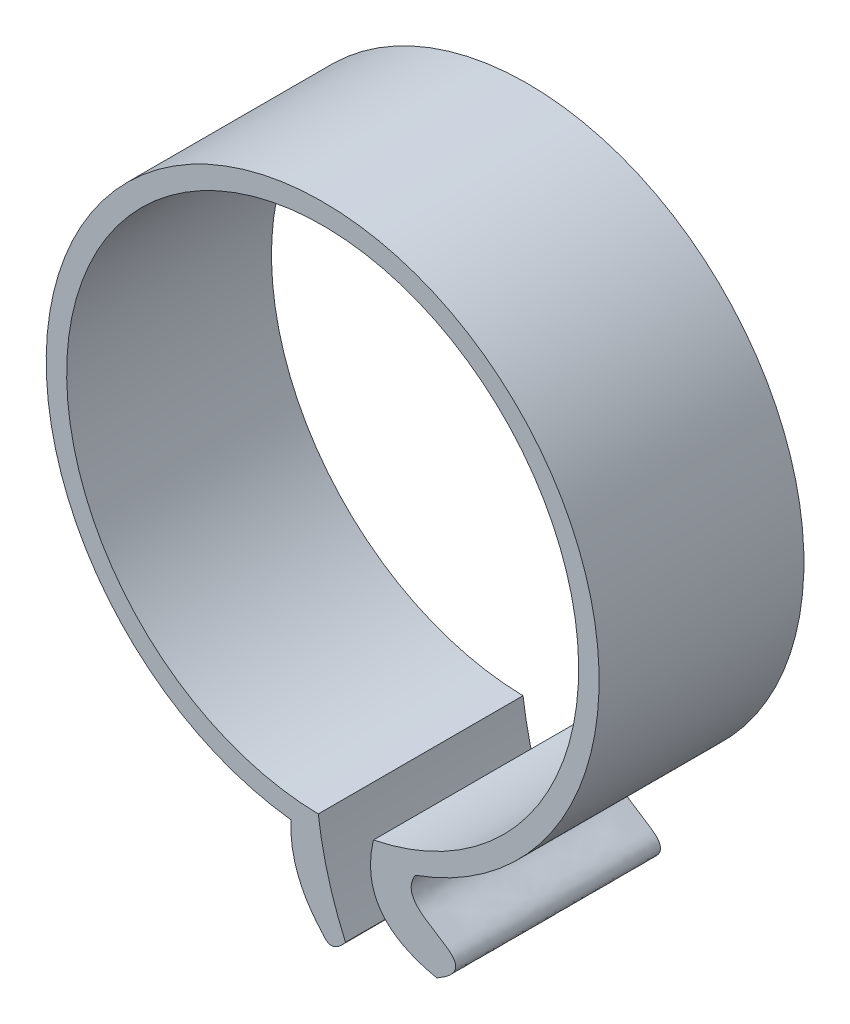
ISO-10303-21;
HEADER;
FILE_DESCRIPTION(('STEP AP214'),'2;1');
FILE_NAME('part.step','',(''),(''),'','','');
FILE_SCHEMA(('AUTOMOTIVE_DESIGN { 1 0 10303 214 1 1 1 1 }'));
ENDSEC;
DATA;
#1=APPLICATION_CONTEXT('core data for automotive mechanical design processes');
#2=APPLICATION_PROTOCOL_DEFINITION('international standard','automotive_design',2000,#1);
#3=PRODUCT_CONTEXT('',#1,'mechanical');
#4=PRODUCT('Part','Part','',(#3));
#5=PRODUCT_RELATED_PRODUCT_CATEGORY('part','',(#4));
#6=PRODUCT_DEFINITION_FORMATION('','',#4);
#7=PRODUCT_DEFINITION_CONTEXT('part definition',#1,'design');
#8=PRODUCT_DEFINITION('design','',#6,#7);
#9=PRODUCT_DEFINITION_SHAPE('','',#8);
#10=(LENGTH_UNIT() NAMED_UNIT(*) SI_UNIT(.MILLI.,.METRE.));
#11=(NAMED_UNIT(*) PLANE_ANGLE_UNIT() SI_UNIT($,.RADIAN.));
#12=(NAMED_UNIT(*) SI_UNIT($,.STERADIAN.) SOLID_ANGLE_UNIT());
#13=UNCERTAINTY_MEASURE_WITH_UNIT(LENGTH_MEASURE(1.E-05),#10,'distance_accuracy_value','');
#14=(GEOMETRIC_REPRESENTATION_CONTEXT(3) GLOBAL_UNCERTAINTY_ASSIGNED_CONTEXT((#13)) GLOBAL_UNIT_ASSIGNED_CONTEXT((#10,
#11,#12)) REPRESENTATION_CONTEXT('',''));
#15=CARTESIAN_POINT('',(0.,0.,0.));
#16=DIRECTION('',(0.,0.,1.));
#17=DIRECTION('',(1.,0.,0.));
#18=AXIS2_PLACEMENT_3D('',#15,#16,#17);
#19=CARTESIAN_POINT('',(1.11542154755995,-17.2603893432157,10.));
#20=CARTESIAN_POINT('',(0.103518304357264,-14.9950560829422,10.));
#21=CARTESIAN_POINT('',(-0.217037466659111,-12.4981156474913,10.));
#22=B_SPLINE_CURVE_WITH_KNOTS('',2,(#19,#20,#21),.UNSPECIFIED.,.F.,.F.,(3,3),(0.,1.),.UNSPECIFIED.);
#23=DIRECTION('',(0.,0.,-1.));
#24=VECTOR('',#23,1.);
#25=SURFACE_OF_LINEAR_EXTRUSION('',#22,#24);
#26=CARTESIAN_POINT('',(1.11542154755995,-17.2603893432157,0.));
#27=CARTESIAN_POINT('',(0.103518304357264,-14.9950560829422,0.));
#28=CARTESIAN_POINT('',(-0.217037466659111,-12.4981156474913,0.));
#29=B_SPLINE_CURVE_WITH_KNOTS('',2,(#26,#27,#28),.UNSPECIFIED.,.F.,.F.,(3,3),(0.,1.),.UNSPECIFIED.);
#30=CARTESIAN_POINT('',(1.11542154755995,-17.2603893432157,0.));
#31=VERTEX_POINT('',#30);
#32=CARTESIAN_POINT('',(-0.217037466659114,-12.4981156474913,0.));
#33=VERTEX_POINT('',#32);
#34=EDGE_CURVE('E225',#31,#33,#29,.T.);
#35=ORIENTED_EDGE('',*,*,#34,.T.);
#36=DIRECTION('',(0.,0.,-1.));
#37=VECTOR('',#36,1.);
#38=CARTESIAN_POINT('',(-0.217037466659114,-12.4981156474913,10.));
#39=LINE('',#38,#37);
#40=CARTESIAN_POINT('',(-0.217037466659114,-12.4981156474913,10.));
#41=VERTEX_POINT('',#40);
#42=EDGE_CURVE('E11',#41,#33,#39,.T.);
#43=ORIENTED_EDGE('',*,*,#42,.F.);
#44=CARTESIAN_POINT('',(1.11542154755995,-17.2603893432157,10.));
#45=VERTEX_POINT('',#44);
#46=EDGE_CURVE('E175',#45,#41,#22,.T.);
#47=ORIENTED_EDGE('',*,*,#46,.F.);
#48=DIRECTION('',(0.,0.,-1.));
#49=VECTOR('',#48,1.);
#50=CARTESIAN_POINT('',(1.11542154755995,-17.2603893432157,10.));
#51=LINE('',#50,#49);
#52=EDGE_CURVE('E131',#45,#31,#51,.T.);
#53=ORIENTED_EDGE('',*,*,#52,.T.);
#54=EDGE_LOOP('',(#35,#43,#47,#53));
#55=FACE_BOUND('',#54,.T.);
#56=ADVANCED_FACE('F39',(#55),#25,.F.);
#57=CARTESIAN_POINT('',(0.,0.,10.));
#58=DIRECTION('',(0.,0.,-1.));
#59=DIRECTION('',(-1.,0.,0.));
#60=AXIS2_PLACEMENT_3D('',#57,#58,#59);
#61=CYLINDRICAL_SURFACE('',#60,12.5);
#62=CARTESIAN_POINT('',(0.,0.,0.));
#63=DIRECTION('',(0.,0.,-1.));
#64=DIRECTION('',(1.,0.,0.));
#65=AXIS2_PLACEMENT_3D('',#62,#63,#64);
#66=CIRCLE('',#65,12.5);
#67=CARTESIAN_POINT('',(2.47842575026643,-12.2518327527116,0.));
#68=VERTEX_POINT('',#67);
#69=EDGE_CURVE('E218',#33,#68,#66,.T.);
#70=ORIENTED_EDGE('',*,*,#69,.T.);
#71=DIRECTION('',(0.,0.,-1.));
#72=VECTOR('',#71,1.);
#73=CARTESIAN_POINT('',(2.47842575026643,-12.2518327527116,10.));
#74=LINE('',#73,#72);
#75=CARTESIAN_POINT('',(2.47842575026643,-12.2518327527116,10.));
#76=VERTEX_POINT('',#75);
#77=EDGE_CURVE('E49',#76,#68,#74,.T.);
#78=ORIENTED_EDGE('',*,*,#77,.F.);
#79=CARTESIAN_POINT('',(0.,0.,10.));
#80=DIRECTION('',(0.,0.,-1.));
#81=DIRECTION('',(1.,0.,0.));
#82=AXIS2_PLACEMENT_3D('',#79,#80,#81);
#83=CIRCLE('',#82,12.5);
#84=EDGE_CURVE('E97',#41,#76,#83,.T.);
#85=ORIENTED_EDGE('',*,*,#84,.F.);
#86=ORIENTED_EDGE('',*,*,#42,.T.);
#87=EDGE_LOOP('',(#70,#78,#85,#86));
#88=FACE_BOUND('',#87,.T.);
#89=ADVANCED_FACE('F252',(#88),#61,.F.);
#90=CARTESIAN_POINT('',(2.47842575026643,-12.2518327527116,10.));
#91=CARTESIAN_POINT('',(1.65495790138646,-15.7273409020841,10.));
#92=CARTESIAN_POINT('',(5.57719429225045,-16.5385568434413,10.));
#93=B_SPLINE_CURVE_WITH_KNOTS('',2,(#90,#91,#92),.UNSPECIFIED.,.F.,.F.,(3,3),(0.,1.),.UNSPECIFIED.);
#94=DIRECTION('',(0.,0.,-1.));
#95=VECTOR('',#94,1.);
#96=SURFACE_OF_LINEAR_EXTRUSION('',#93,#95);
#97=CARTESIAN_POINT('',(2.47842575026643,-12.2518327527116,0.));
#98=CARTESIAN_POINT('',(1.65495790138646,-15.7273409020841,0.));
#99=CARTESIAN_POINT('',(5.57719429225045,-16.5385568434413,0.));
#100=B_SPLINE_CURVE_WITH_KNOTS('',2,(#97,#98,#99),.UNSPECIFIED.,.F.,.F.,(3,3),(0.,1.),.UNSPECIFIED.);
#101=CARTESIAN_POINT('',(5.57719429225045,-16.5385568434413,0.));
#102=VERTEX_POINT('',#101);
#103=EDGE_CURVE('E213',#68,#102,#100,.T.);
#104=ORIENTED_EDGE('',*,*,#103,.T.);
#105=DIRECTION('',(0.,0.,-1.));
#106=VECTOR('',#105,1.);
#107=CARTESIAN_POINT('',(5.57719429225045,-16.5385568434413,10.));
#108=LINE('',#107,#106);
#109=CARTESIAN_POINT('',(5.57719429225045,-16.5385568434413,10.));
#110=VERTEX_POINT('',#109);
#111=EDGE_CURVE('E204',#110,#102,#108,.T.);
#112=ORIENTED_EDGE('',*,*,#111,.F.);
#113=EDGE_CURVE('E162',#76,#110,#93,.T.);
#114=ORIENTED_EDGE('',*,*,#113,.F.);
#115=ORIENTED_EDGE('',*,*,#77,.T.);
#116=EDGE_LOOP('',(#104,#112,#114,#115));
#117=FACE_BOUND('',#116,.T.);
#118=ADVANCED_FACE('F155',(#117),#96,.F.);
#119=CARTESIAN_POINT('',(5.57719429225045,-16.5385568434413,10.));
#120=CARTESIAN_POINT('',(8.54920632253616,-14.8421020857261,10.));
#121=CARTESIAN_POINT('',(3.25322922840647,-14.7466427679077,10.));
#122=CARTESIAN_POINT('',(4.52401427506193,-12.7194062298142,10.));
#123=B_SPLINE_CURVE_WITH_KNOTS('',3,(#119,#120,#121,#122),.UNSPECIFIED.,.F.,.F.,(4,4),(0.,1.),.UNSPECIFIED.);
#124=DIRECTION('',(0.,0.,-1.));
#125=VECTOR('',#124,1.);
#126=SURFACE_OF_LINEAR_EXTRUSION('',#123,#125);
#127=CARTESIAN_POINT('',(5.57719429225045,-16.5385568434413,0.));
#128=CARTESIAN_POINT('',(8.54920632253616,-14.8421020857261,0.));
#129=CARTESIAN_POINT('',(3.25322922840647,-14.7466427679077,0.));
#130=CARTESIAN_POINT('',(4.52401427506193,-12.7194062298142,0.));
#131=B_SPLINE_CURVE_WITH_KNOTS('',3,(#127,#128,#129,#130),.UNSPECIFIED.,.F.,.F.,(4,4),(0.,1.),.UNSPECIFIED.);
#132=CARTESIAN_POINT('',(4.52401427506193,-12.7194062298142,0.));
#133=VERTEX_POINT('',#132);
#134=EDGE_CURVE('E219',#102,#133,#131,.T.);
#135=ORIENTED_EDGE('',*,*,#134,.T.);
#136=DIRECTION('',(0.,0.,-1.));
#137=VECTOR('',#136,1.);
#138=CARTESIAN_POINT('',(4.52401427506193,-12.7194062298142,10.));
#139=LINE('',#138,#137);
#140=CARTESIAN_POINT('',(4.52401427506193,-12.7194062298142,10.));
#141=VERTEX_POINT('',#140);
#142=EDGE_CURVE('E124',#141,#133,#139,.T.);
#143=ORIENTED_EDGE('',*,*,#142,.F.);
#144=EDGE_CURVE('E113',#110,#141,#123,.T.);
#145=ORIENTED_EDGE('',*,*,#144,.F.);
#146=ORIENTED_EDGE('',*,*,#111,.T.);
#147=EDGE_LOOP('',(#135,#143,#145,#146));
#148=FACE_BOUND('',#147,.T.);
#149=ADVANCED_FACE('F152',(#148),#126,.F.);
#150=CARTESIAN_POINT('',(0.,0.,10.));
#151=DIRECTION('',(0.,0.,-1.));
#152=DIRECTION('',(-1.,0.,0.));
#153=AXIS2_PLACEMENT_3D('',#150,#151,#152);
#154=CYLINDRICAL_SURFACE('',#153,13.5);
#155=CARTESIAN_POINT('',(0.,0.,0.));
#156=DIRECTION('',(0.,0.,1.));
#157=DIRECTION('',(1.,0.,0.));
#158=AXIS2_PLACEMENT_3D('',#155,#156,#157);
#159=CIRCLE('',#158,13.5);
#160=CARTESIAN_POINT('',(-1.55602176295616,-13.4100259609445,0.));
#161=VERTEX_POINT('',#160);
#162=EDGE_CURVE('E122',#133,#161,#159,.T.);
#163=ORIENTED_EDGE('',*,*,#162,.T.);
#164=DIRECTION('',(0.,0.,-1.));
#165=VECTOR('',#164,1.);
#166=CARTESIAN_POINT('',(-1.55602176295616,-13.4100259609445,10.));
#167=LINE('',#166,#165);
#168=CARTESIAN_POINT('',(-1.55602176295616,-13.4100259609445,10.));
#169=VERTEX_POINT('',#168);
#170=EDGE_CURVE('E119',#169,#161,#167,.T.);
#171=ORIENTED_EDGE('',*,*,#170,.F.);
#172=CARTESIAN_POINT('',(0.,0.,10.));
#173=DIRECTION('',(0.,0.,1.));
#174=DIRECTION('',(1.,0.,0.));
#175=AXIS2_PLACEMENT_3D('',#172,#173,#174);
#176=CIRCLE('',#175,13.5);
#177=EDGE_CURVE('E107',#141,#169,#176,.T.);
#178=ORIENTED_EDGE('',*,*,#177,.F.);
#179=ORIENTED_EDGE('',*,*,#142,.T.);
#180=EDGE_LOOP('',(#163,#171,#178,#179));
#181=FACE_BOUND('',#180,.T.);
#182=ADVANCED_FACE('F120',(#181),#154,.T.);
#183=CARTESIAN_POINT('',(-1.55602176295615,-13.4100259609445,10.));
#184=CARTESIAN_POINT('',(-1.60984057256603,-14.9376308839415,10.));
#185=CARTESIAN_POINT('',(-1.09116665158106,-16.2835326343532,10.));
#186=CARTESIAN_POINT('',(0.,-17.4477312121439,10.));
#187=B_SPLINE_CURVE_WITH_KNOTS('',3,(#183,#184,#185,#186),.UNSPECIFIED.,.F.,.F.,(4,4),(0.,
0.825397526030645),.UNSPECIFIED.);
#188=DIRECTION('',(0.,0.,-1.));
#189=VECTOR('',#188,1.);
#190=SURFACE_OF_LINEAR_EXTRUSION('',#187,#189);
#191=CARTESIAN_POINT('',(-1.55602176295615,-13.4100259609445,0.));
#192=CARTESIAN_POINT('',(-1.60984057256603,-14.9376308839415,0.));
#193=CARTESIAN_POINT('',(-1.09116665158106,-16.2835326343532,0.));
#194=CARTESIAN_POINT('',(0.,-17.4477312121439,0.));
#195=B_SPLINE_CURVE_WITH_KNOTS('',3,(#191,#192,#193,#194),.UNSPECIFIED.,.F.,.F.,(4,4),(0.,
0.825397526030645),.UNSPECIFIED.);
#196=CARTESIAN_POINT('',(0.,-17.4477312121439,0.));
#197=VERTEX_POINT('',#196);
#198=EDGE_CURVE('E83',#161,#197,#195,.T.);
#199=ORIENTED_EDGE('',*,*,#198,.T.);
#200=DIRECTION('',(0.,0.,-1.));
#201=VECTOR('',#200,1.);
#202=CARTESIAN_POINT('',(0.,-17.4477312121439,10.));
#203=LINE('',#202,#201);
#204=CARTESIAN_POINT('',(0.,-17.4477312121439,10.));
#205=VERTEX_POINT('',#204);
#206=EDGE_CURVE('E125',#205,#197,#203,.T.);
#207=ORIENTED_EDGE('',*,*,#206,.F.);
#208=EDGE_CURVE('E111',#169,#205,#187,.T.);
#209=ORIENTED_EDGE('',*,*,#208,.F.);
#210=ORIENTED_EDGE('',*,*,#170,.T.);
#211=EDGE_LOOP('',(#199,#207,#209,#210));
#212=FACE_BOUND('',#211,.T.);
#213=ADVANCED_FACE('F127',(#212),#190,.F.);
#214=CARTESIAN_POINT('',(0.,-17.4477312121439,10.));
#215=CARTESIAN_POINT('',(0.434564651498744,-18.1085743271519,10.));
#216=CARTESIAN_POINT('',(1.11542154755995,-17.2603893432157,10.));
#217=B_SPLINE_CURVE_WITH_KNOTS('',2,(#214,#215,#216),.UNSPECIFIED.,.F.,.F.,(3,3),(0.,1.),.UNSPECIFIED.);
#218=DIRECTION('',(0.,0.,-1.));
#219=VECTOR('',#218,1.);
#220=SURFACE_OF_LINEAR_EXTRUSION('',#217,#219);
#221=CARTESIAN_POINT('',(0.,-17.4477312121439,0.));
#222=CARTESIAN_POINT('',(0.434564651498744,-18.1085743271519,0.));
#223=CARTESIAN_POINT('',(1.11542154755995,-17.2603893432157,0.));
#224=B_SPLINE_CURVE_WITH_KNOTS('',2,(#221,#222,#223),.UNSPECIFIED.,.F.,.F.,(3,3),(0.,1.),.UNSPECIFIED.);
#225=EDGE_CURVE('E89',#197,#31,#224,.T.);
#226=ORIENTED_EDGE('',*,*,#225,.T.);
#227=ORIENTED_EDGE('',*,*,#52,.F.);
#228=EDGE_CURVE('E57',#205,#45,#217,.T.);
#229=ORIENTED_EDGE('',*,*,#228,.F.);
#230=ORIENTED_EDGE('',*,*,#206,.T.);
#231=EDGE_LOOP('',(#226,#227,#229,#230));
#232=FACE_BOUND('',#231,.T.);
#233=ADVANCED_FACE('F148',(#232),#220,.F.);
#234=CARTESIAN_POINT('',(0.276355172403841,-14.9371542891478,10.));
#235=DIRECTION('',(0.,0.,-1.));
#236=DIRECTION('',(-1.,0.,0.));
#237=AXIS2_PLACEMENT_3D('',#234,#235,#236);
#238=PLANE('',#237);
#239=ORIENTED_EDGE('',*,*,#46,.T.);
#240=ORIENTED_EDGE('',*,*,#84,.T.);
#241=ORIENTED_EDGE('',*,*,#113,.T.);
#242=ORIENTED_EDGE('',*,*,#144,.T.);
#243=ORIENTED_EDGE('',*,*,#177,.T.);
#244=ORIENTED_EDGE('',*,*,#208,.T.);
#245=ORIENTED_EDGE('',*,*,#228,.T.);
#246=EDGE_LOOP('',(#239,#240,#241,#242,#243,#244,#245));
#247=FACE_BOUND('',#246,.T.);
#248=ADVANCED_FACE('F109',(#247),#238,.F.);
#249=CARTESIAN_POINT('',(0.276355172403841,-14.9371542891478,0.));
#250=DIRECTION('',(0.,0.,-1.));
#251=DIRECTION('',(-1.,0.,0.));
#252=AXIS2_PLACEMENT_3D('',#249,#250,#251);
#253=PLANE('',#252);
#254=ORIENTED_EDGE('',*,*,#34,.F.);
#255=ORIENTED_EDGE('',*,*,#225,.F.);
#256=ORIENTED_EDGE('',*,*,#198,.F.);
#257=ORIENTED_EDGE('',*,*,#162,.F.);
#258=ORIENTED_EDGE('',*,*,#134,.F.);
#259=ORIENTED_EDGE('',*,*,#103,.F.);
#260=ORIENTED_EDGE('',*,*,#69,.F.);
#261=EDGE_LOOP('',(#254,#255,#256,#257,#258,#259,#260));
#262=FACE_BOUND('',#261,.T.);
#263=ADVANCED_FACE('F217',(#262),#253,.T.);
#264=CLOSED_SHELL('',(#56,#89,#118,#149,#182,#213,#233,#248,#263));
#265=MANIFOLD_SOLID_BREP('B2',#264);
#266=ADVANCED_BREP_SHAPE_REPRESENTATION('',(#18,#265),#14);
#267=SHAPE_DEFINITION_REPRESENTATION(#9,#266);
ENDSEC;
END-ISO-10303-21;
